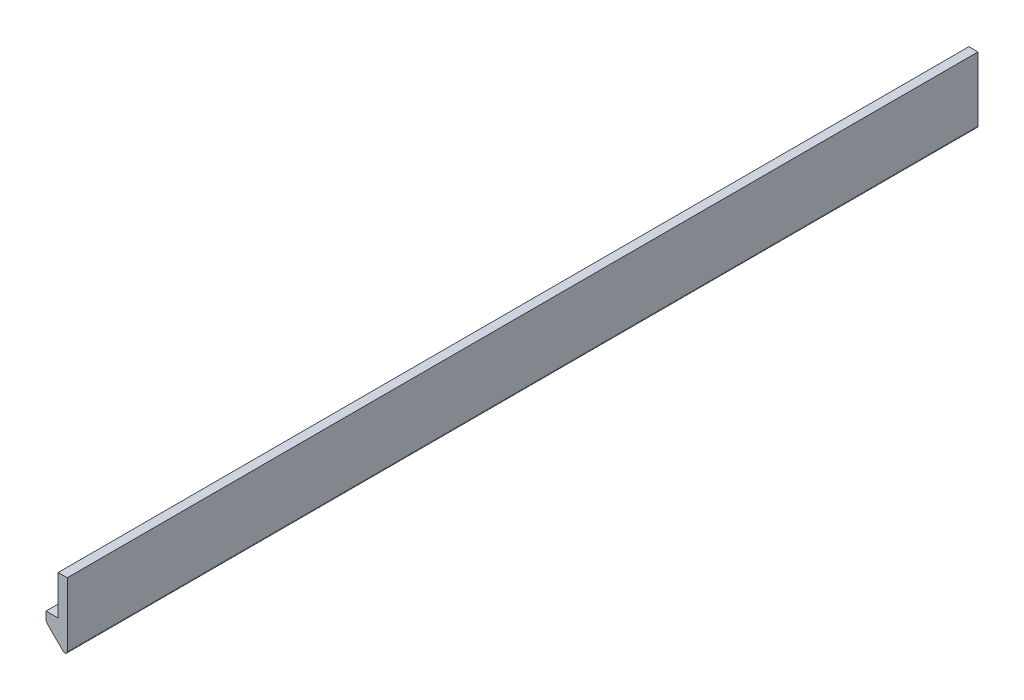
ISO-10303-21;
HEADER;
FILE_DESCRIPTION(('STEP AP214'),'2;1');
FILE_NAME('part.step','',(''),(''),'','','');
FILE_SCHEMA(('AUTOMOTIVE_DESIGN { 1 0 10303 214 1 1 1 1 }'));
ENDSEC;
DATA;
#1=APPLICATION_CONTEXT('core data for automotive mechanical design processes');
#2=APPLICATION_PROTOCOL_DEFINITION('international standard','automotive_design',2000,#1);
#3=PRODUCT_CONTEXT('',#1,'mechanical');
#4=PRODUCT('Part','Part','',(#3));
#5=PRODUCT_RELATED_PRODUCT_CATEGORY('part','',(#4));
#6=PRODUCT_DEFINITION_FORMATION('','',#4);
#7=PRODUCT_DEFINITION_CONTEXT('part definition',#1,'design');
#8=PRODUCT_DEFINITION('design','',#6,#7);
#9=PRODUCT_DEFINITION_SHAPE('','',#8);
#10=(LENGTH_UNIT() NAMED_UNIT(*) SI_UNIT(.MILLI.,.METRE.));
#11=(NAMED_UNIT(*) PLANE_ANGLE_UNIT() SI_UNIT($,.RADIAN.));
#12=(NAMED_UNIT(*) SI_UNIT($,.STERADIAN.) SOLID_ANGLE_UNIT());
#13=UNCERTAINTY_MEASURE_WITH_UNIT(LENGTH_MEASURE(1.E-05),#10,'distance_accuracy_value','');
#14=(GEOMETRIC_REPRESENTATION_CONTEXT(3) GLOBAL_UNCERTAINTY_ASSIGNED_CONTEXT((#13)) GLOBAL_UNIT_ASSIGNED_CONTEXT((#10,
#11,#12)) REPRESENTATION_CONTEXT('',''));
#15=CARTESIAN_POINT('',(0.,0.,0.));
#16=DIRECTION('',(0.,0.,1.));
#17=DIRECTION('',(1.,0.,0.));
#18=AXIS2_PLACEMENT_3D('',#15,#16,#17);
#19=CARTESIAN_POINT('',(-7.,7.,-20.));
#20=DIRECTION('',(-1.,0.,0.));
#21=DIRECTION('',(0.,0.,1.));
#22=AXIS2_PLACEMENT_3D('',#19,#20,#21);
#23=PLANE('',#22);
#24=DIRECTION('',(0.,-1.,0.));
#25=VECTOR('',#24,1.);
#26=CARTESIAN_POINT('',(-7.,7.,-20.));
#27=LINE('',#26,#25);
#28=CARTESIAN_POINT('',(-7.,7.,-20.));
#29=VERTEX_POINT('',#28);
#30=CARTESIAN_POINT('',(-7.,4.62132034355964,-20.));
#31=VERTEX_POINT('',#30);
#32=EDGE_CURVE('E168',#29,#31,#27,.T.);
#33=ORIENTED_EDGE('',*,*,#32,.T.);
#34=DIRECTION('',(0.,0.,1.));
#35=VECTOR('',#34,1.);
#36=CARTESIAN_POINT('',(-7.,4.62132034355964,-20.));
#37=LINE('',#36,#35);
#38=CARTESIAN_POINT('',(-7.,4.62132034355964,280.));
#39=VERTEX_POINT('',#38);
#40=EDGE_CURVE('E172',#31,#39,#37,.T.);
#41=ORIENTED_EDGE('',*,*,#40,.T.);
#42=DIRECTION('',(0.,-1.,0.));
#43=VECTOR('',#42,1.);
#44=CARTESIAN_POINT('',(-7.,7.,280.));
#45=LINE('',#44,#43);
#46=CARTESIAN_POINT('',(-7.,7.,280.));
#47=VERTEX_POINT('',#46);
#48=EDGE_CURVE('E148',#47,#39,#45,.T.);
#49=ORIENTED_EDGE('',*,*,#48,.F.);
#50=DIRECTION('',(0.,0.,1.));
#51=VECTOR('',#50,1.);
#52=CARTESIAN_POINT('',(-7.,7.,-20.));
#53=LINE('',#52,#51);
#54=EDGE_CURVE('E169',#29,#47,#53,.T.);
#55=ORIENTED_EDGE('',*,*,#54,.F.);
#56=EDGE_LOOP('',(#33,#41,#49,#55));
#57=FACE_BOUND('',#56,.T.);
#58=ADVANCED_FACE('F46',(#57),#23,.T.);
#59=CARTESIAN_POINT('',(-3.,7.,-20.));
#60=DIRECTION('',(0.,1.,0.));
#61=DIRECTION('',(0.,0.,1.));
#62=AXIS2_PLACEMENT_3D('',#59,#60,#61);
#63=PLANE('',#62);
#64=DIRECTION('',(-1.,0.,0.));
#65=VECTOR('',#64,1.);
#66=CARTESIAN_POINT('',(-3.,7.,280.));
#67=LINE('',#66,#65);
#68=CARTESIAN_POINT('',(-3.,7.,280.));
#69=VERTEX_POINT('',#68);
#70=EDGE_CURVE('E164',#69,#47,#67,.T.);
#71=ORIENTED_EDGE('',*,*,#70,.F.);
#72=DIRECTION('',(0.,0.,1.));
#73=VECTOR('',#72,1.);
#74=CARTESIAN_POINT('',(-3.,7.,-20.));
#75=LINE('',#74,#73);
#76=CARTESIAN_POINT('',(-3.,7.,-20.));
#77=VERTEX_POINT('',#76);
#78=EDGE_CURVE('E173',#77,#69,#75,.T.);
#79=ORIENTED_EDGE('',*,*,#78,.F.);
#80=DIRECTION('',(-1.,0.,0.));
#81=VECTOR('',#80,1.);
#82=CARTESIAN_POINT('',(-3.,7.,-20.));
#83=LINE('',#82,#81);
#84=EDGE_CURVE('E132',#77,#29,#83,.T.);
#85=ORIENTED_EDGE('',*,*,#84,.T.);
#86=ORIENTED_EDGE('',*,*,#54,.T.);
#87=EDGE_LOOP('',(#71,#79,#85,#86));
#88=FACE_BOUND('',#87,.T.);
#89=ADVANCED_FACE('F215',(#88),#63,.T.);
#90=CARTESIAN_POINT('',(-3.,20.,-20.));
#91=DIRECTION('',(-1.,0.,0.));
#92=DIRECTION('',(0.,0.,1.));
#93=AXIS2_PLACEMENT_3D('',#90,#91,#92);
#94=PLANE('',#93);
#95=DIRECTION('',(0.,-1.,0.));
#96=VECTOR('',#95,1.);
#97=CARTESIAN_POINT('',(-3.,20.,280.));
#98=LINE('',#97,#96);
#99=CARTESIAN_POINT('',(-3.,20.,280.));
#100=VERTEX_POINT('',#99);
#101=EDGE_CURVE('E160',#100,#69,#98,.T.);
#102=ORIENTED_EDGE('',*,*,#101,.F.);
#103=DIRECTION('',(0.,0.,1.));
#104=VECTOR('',#103,1.);
#105=CARTESIAN_POINT('',(-3.,20.,-20.));
#106=LINE('',#105,#104);
#107=CARTESIAN_POINT('',(-3.,20.,-20.));
#108=VERTEX_POINT('',#107);
#109=EDGE_CURVE('E131',#108,#100,#106,.T.);
#110=ORIENTED_EDGE('',*,*,#109,.F.);
#111=DIRECTION('',(0.,-1.,0.));
#112=VECTOR('',#111,1.);
#113=CARTESIAN_POINT('',(-3.,20.,-20.));
#114=LINE('',#113,#112);
#115=EDGE_CURVE('E138',#108,#77,#114,.T.);
#116=ORIENTED_EDGE('',*,*,#115,.T.);
#117=ORIENTED_EDGE('',*,*,#78,.T.);
#118=EDGE_LOOP('',(#102,#110,#116,#117));
#119=FACE_BOUND('',#118,.T.);
#120=ADVANCED_FACE('F216',(#119),#94,.T.);
#121=CARTESIAN_POINT('',(0.,20.,-20.));
#122=DIRECTION('',(0.,1.,0.));
#123=DIRECTION('',(0.,0.,1.));
#124=AXIS2_PLACEMENT_3D('',#121,#122,#123);
#125=PLANE('',#124);
#126=DIRECTION('',(-1.,0.,0.));
#127=VECTOR('',#126,1.);
#128=CARTESIAN_POINT('',(0.,20.,280.));
#129=LINE('',#128,#127);
#130=CARTESIAN_POINT('',(0.,20.,280.));
#131=VERTEX_POINT('',#130);
#132=EDGE_CURVE('E129',#131,#100,#129,.T.);
#133=ORIENTED_EDGE('',*,*,#132,.F.);
#134=DIRECTION('',(0.,0.,1.));
#135=VECTOR('',#134,1.);
#136=CARTESIAN_POINT('',(0.,20.,-20.));
#137=LINE('',#136,#135);
#138=CARTESIAN_POINT('',(0.,20.,-20.));
#139=VERTEX_POINT('',#138);
#140=EDGE_CURVE('E116',#139,#131,#137,.T.);
#141=ORIENTED_EDGE('',*,*,#140,.F.);
#142=DIRECTION('',(-1.,0.,0.));
#143=VECTOR('',#142,1.);
#144=CARTESIAN_POINT('',(0.,20.,-20.));
#145=LINE('',#144,#143);
#146=EDGE_CURVE('E122',#139,#108,#145,.T.);
#147=ORIENTED_EDGE('',*,*,#146,.T.);
#148=ORIENTED_EDGE('',*,*,#109,.T.);
#149=EDGE_LOOP('',(#133,#141,#147,#148));
#150=FACE_BOUND('',#149,.T.);
#151=ADVANCED_FACE('F127',(#150),#125,.T.);
#152=CARTESIAN_POINT('',(0.,0.,-20.));
#153=DIRECTION('',(1.,0.,0.));
#154=DIRECTION('',(0.,1.,0.));
#155=AXIS2_PLACEMENT_3D('',#152,#153,#154);
#156=PLANE('',#155);
#157=DIRECTION('',(0.,1.,0.));
#158=VECTOR('',#157,1.);
#159=CARTESIAN_POINT('',(0.,0.,280.));
#160=LINE('',#159,#158);
#161=CARTESIAN_POINT('',(0.,-1.06862915010152,280.));
#162=VERTEX_POINT('',#161);
#163=EDGE_CURVE('E155',#162,#131,#160,.T.);
#164=ORIENTED_EDGE('',*,*,#163,.F.);
#165=DIRECTION('',(0.,0.,-1.));
#166=VECTOR('',#165,1.);
#167=CARTESIAN_POINT('',(0.,-1.06862915010152,-20.));
#168=LINE('',#167,#166);
#169=CARTESIAN_POINT('',(0.,-1.06862915010152,-20.));
#170=VERTEX_POINT('',#169);
#171=EDGE_CURVE('E119',#162,#170,#168,.T.);
#172=ORIENTED_EDGE('',*,*,#171,.T.);
#173=DIRECTION('',(0.,1.,0.));
#174=VECTOR('',#173,1.);
#175=CARTESIAN_POINT('',(0.,0.,-20.));
#176=LINE('',#175,#174);
#177=EDGE_CURVE('E112',#170,#139,#176,.T.);
#178=ORIENTED_EDGE('',*,*,#177,.T.);
#179=ORIENTED_EDGE('',*,*,#140,.T.);
#180=EDGE_LOOP('',(#164,#172,#178,#179));
#181=FACE_BOUND('',#180,.T.);
#182=ADVANCED_FACE('F115',(#181),#156,.T.);
#183=CARTESIAN_POINT('',(-7.,4.,-20.));
#184=DIRECTION('',(-0.707106781186548,-0.707106781186548,0.));
#185=DIRECTION('',(0.707106781186548,-0.707106781186548,0.));
#186=AXIS2_PLACEMENT_3D('',#183,#184,#185);
#187=PLANE('',#186);
#188=DIRECTION('',(0.707106781186548,-0.707106781186548,0.));
#189=VECTOR('',#188,1.);
#190=CARTESIAN_POINT('',(-7.,4.,-20.));
#191=LINE('',#190,#189);
#192=CARTESIAN_POINT('',(-6.56066017177982,3.56066017177982,-20.));
#193=VERTEX_POINT('',#192);
#194=CARTESIAN_POINT('',(-1.36568542494924,-1.63431457505076,-20.));
#195=VERTEX_POINT('',#194);
#196=EDGE_CURVE('E123',#193,#195,#191,.T.);
#197=ORIENTED_EDGE('',*,*,#196,.T.);
#198=DIRECTION('',(0.,0.,-1.));
#199=VECTOR('',#198,1.);
#200=CARTESIAN_POINT('',(-1.36568542494924,-1.63431457505076,-20.));
#201=LINE('',#200,#199);
#202=CARTESIAN_POINT('',(-1.36568542494924,-1.63431457505076,280.));
#203=VERTEX_POINT('',#202);
#204=EDGE_CURVE('E55',#195,#203,#201,.F.);
#205=ORIENTED_EDGE('',*,*,#204,.T.);
#206=DIRECTION('',(0.707106781186548,-0.707106781186548,0.));
#207=VECTOR('',#206,1.);
#208=CARTESIAN_POINT('',(-7.,4.,280.));
#209=LINE('',#208,#207);
#210=CARTESIAN_POINT('',(-6.56066017177982,3.56066017177982,280.));
#211=VERTEX_POINT('',#210);
#212=EDGE_CURVE('E152',#211,#203,#209,.T.);
#213=ORIENTED_EDGE('',*,*,#212,.F.);
#214=DIRECTION('',(0.,0.,1.));
#215=VECTOR('',#214,1.);
#216=CARTESIAN_POINT('',(-6.56066017177982,3.56066017177982,-20.));
#217=LINE('',#216,#215);
#218=EDGE_CURVE('E184',#211,#193,#217,.F.);
#219=ORIENTED_EDGE('',*,*,#218,.T.);
#220=EDGE_LOOP('',(#197,#205,#213,#219));
#221=FACE_BOUND('',#220,.T.);
#222=ADVANCED_FACE('F208',(#221),#187,.T.);
#223=CARTESIAN_POINT('',(0.,0.,-20.));
#224=DIRECTION('',(0.,0.,1.));
#225=DIRECTION('',(1.,0.,0.));
#226=AXIS2_PLACEMENT_3D('',#223,#224,#225);
#227=PLANE('',#226);
#228=ORIENTED_EDGE('',*,*,#177,.F.);
#229=CARTESIAN_POINT('',(-0.8,-1.06862915010153,-20.));
#230=DIRECTION('',(0.,0.,1.));
#231=DIRECTION('',(1.,0.,0.));
#232=AXIS2_PLACEMENT_3D('',#229,#230,#231);
#233=CIRCLE('',#232,0.8);
#234=EDGE_CURVE('E69',#170,#195,#233,.F.);
#235=ORIENTED_EDGE('',*,*,#234,.T.);
#236=ORIENTED_EDGE('',*,*,#196,.F.);
#237=CARTESIAN_POINT('',(-5.5,4.62132034355964,-20.));
#238=DIRECTION('',(0.,0.,1.));
#239=DIRECTION('',(1.,0.,0.));
#240=AXIS2_PLACEMENT_3D('',#237,#238,#239);
#241=CIRCLE('',#240,1.5);
#242=EDGE_CURVE('E187',#193,#31,#241,.F.);
#243=ORIENTED_EDGE('',*,*,#242,.T.);
#244=ORIENTED_EDGE('',*,*,#32,.F.);
#245=ORIENTED_EDGE('',*,*,#84,.F.);
#246=ORIENTED_EDGE('',*,*,#115,.F.);
#247=ORIENTED_EDGE('',*,*,#146,.F.);
#248=EDGE_LOOP('',(#228,#235,#236,#243,#244,#245,#246,#247));
#249=FACE_BOUND('',#248,.T.);
#250=ADVANCED_FACE('F135',(#249),#227,.F.);
#251=CARTESIAN_POINT('',(0.,0.,280.));
#252=DIRECTION('',(0.,0.,1.));
#253=DIRECTION('',(1.,0.,0.));
#254=AXIS2_PLACEMENT_3D('',#251,#252,#253);
#255=PLANE('',#254);
#256=ORIENTED_EDGE('',*,*,#212,.T.);
#257=CARTESIAN_POINT('',(-0.8,-1.06862915010153,280.));
#258=DIRECTION('',(0.,0.,1.));
#259=DIRECTION('',(1.,0.,0.));
#260=AXIS2_PLACEMENT_3D('',#257,#258,#259);
#261=CIRCLE('',#260,0.8);
#262=EDGE_CURVE('E11',#203,#162,#261,.T.);
#263=ORIENTED_EDGE('',*,*,#262,.T.);
#264=ORIENTED_EDGE('',*,*,#163,.T.);
#265=ORIENTED_EDGE('',*,*,#132,.T.);
#266=ORIENTED_EDGE('',*,*,#101,.T.);
#267=ORIENTED_EDGE('',*,*,#70,.T.);
#268=ORIENTED_EDGE('',*,*,#48,.T.);
#269=CARTESIAN_POINT('',(-5.5,4.62132034355964,280.));
#270=DIRECTION('',(0.,0.,1.));
#271=DIRECTION('',(1.,0.,0.));
#272=AXIS2_PLACEMENT_3D('',#269,#270,#271);
#273=CIRCLE('',#272,1.5);
#274=EDGE_CURVE('E181',#39,#211,#273,.T.);
#275=ORIENTED_EDGE('',*,*,#274,.T.);
#276=EDGE_LOOP('',(#256,#263,#264,#265,#266,#267,#268,#275));
#277=FACE_BOUND('',#276,.T.);
#278=ADVANCED_FACE('F206',(#277),#255,.T.);
#279=CARTESIAN_POINT('',(-5.5,4.62132034355964,-20.));
#280=DIRECTION('',(0.,0.,1.));
#281=DIRECTION('',(1.,0.,0.));
#282=AXIS2_PLACEMENT_3D('',#279,#280,#281);
#283=CYLINDRICAL_SURFACE('',#282,1.5);
#284=ORIENTED_EDGE('',*,*,#242,.F.);
#285=ORIENTED_EDGE('',*,*,#218,.F.);
#286=ORIENTED_EDGE('',*,*,#274,.F.);
#287=ORIENTED_EDGE('',*,*,#40,.F.);
#288=EDGE_LOOP('',(#284,#285,#286,#287));
#289=FACE_BOUND('',#288,.T.);
#290=ADVANCED_FACE('F204',(#289),#283,.T.);
#291=CARTESIAN_POINT('',(-0.8,-1.06862915010153,-20.));
#292=DIRECTION('',(0.,0.,-1.));
#293=DIRECTION('',(-1.,0.,0.));
#294=AXIS2_PLACEMENT_3D('',#291,#292,#293);
#295=CYLINDRICAL_SURFACE('',#294,0.8);
#296=ORIENTED_EDGE('',*,*,#262,.F.);
#297=ORIENTED_EDGE('',*,*,#204,.F.);
#298=ORIENTED_EDGE('',*,*,#234,.F.);
#299=ORIENTED_EDGE('',*,*,#171,.F.);
#300=EDGE_LOOP('',(#296,#297,#298,#299));
#301=FACE_BOUND('',#300,.T.);
#302=ADVANCED_FACE('F48',(#301),#295,.T.);
#303=CLOSED_SHELL('',(#58,#89,#120,#151,#182,#222,#250,#278,#290,#302));
#304=MANIFOLD_SOLID_BREP('B2',#303);
#305=ADVANCED_BREP_SHAPE_REPRESENTATION('',(#18,#304),#14);
#306=SHAPE_DEFINITION_REPRESENTATION(#9,#305);
ENDSEC;
END-ISO-10303-21;
